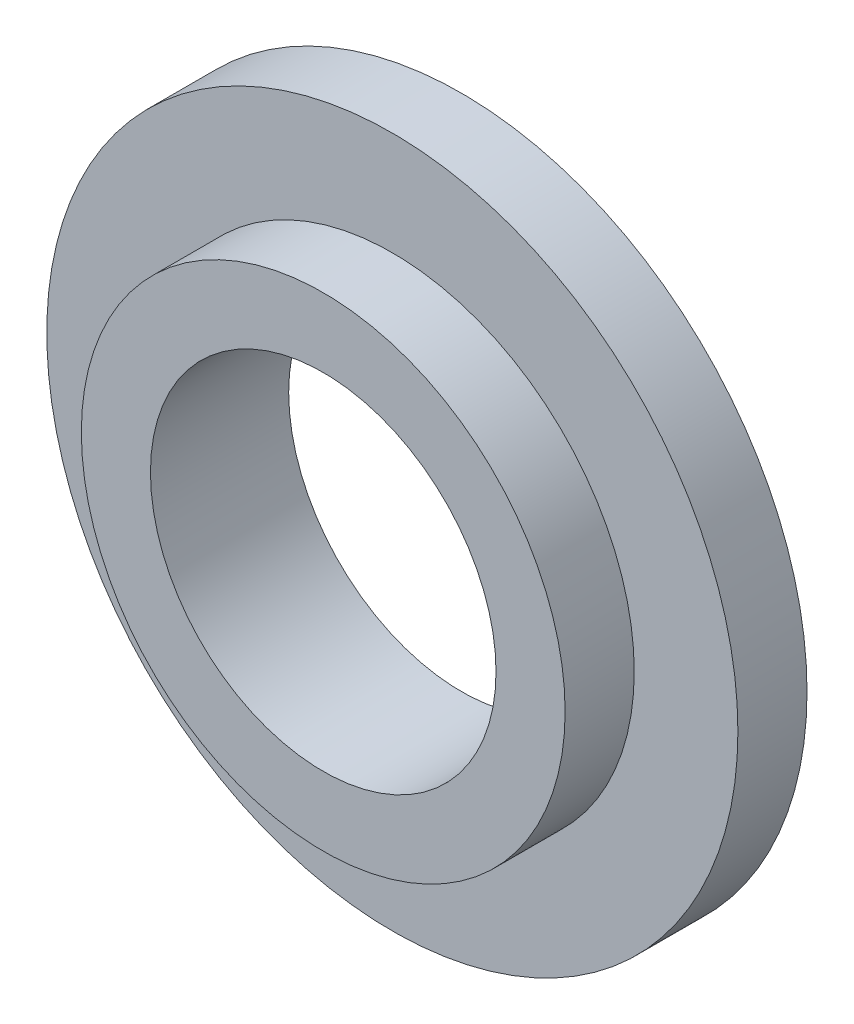
ISO-10303-21;
HEADER;
FILE_DESCRIPTION(('STEP AP214'),'2;1');
FILE_NAME('part.step','',(''),(''),'','','');
FILE_SCHEMA(('AUTOMOTIVE_DESIGN { 1 0 10303 214 1 1 1 1 }'));
ENDSEC;
DATA;
#1=APPLICATION_CONTEXT('core data for automotive mechanical design processes');
#2=APPLICATION_PROTOCOL_DEFINITION('international standard','automotive_design',2000,#1);
#3=PRODUCT_CONTEXT('',#1,'mechanical');
#4=PRODUCT('Part','Part','',(#3));
#5=PRODUCT_RELATED_PRODUCT_CATEGORY('part','',(#4));
#6=PRODUCT_DEFINITION_FORMATION('','',#4);
#7=PRODUCT_DEFINITION_CONTEXT('part definition',#1,'design');
#8=PRODUCT_DEFINITION('design','',#6,#7);
#9=PRODUCT_DEFINITION_SHAPE('','',#8);
#10=(LENGTH_UNIT() NAMED_UNIT(*) SI_UNIT(.MILLI.,.METRE.));
#11=(NAMED_UNIT(*) PLANE_ANGLE_UNIT() SI_UNIT($,.RADIAN.));
#12=(NAMED_UNIT(*) SI_UNIT($,.STERADIAN.) SOLID_ANGLE_UNIT());
#13=UNCERTAINTY_MEASURE_WITH_UNIT(LENGTH_MEASURE(1.E-05),#10,'distance_accuracy_value','');
#14=(GEOMETRIC_REPRESENTATION_CONTEXT(3) GLOBAL_UNCERTAINTY_ASSIGNED_CONTEXT((#13)) GLOBAL_UNIT_ASSIGNED_CONTEXT((#10,
#11,#12)) REPRESENTATION_CONTEXT('',''));
#15=CARTESIAN_POINT('',(0.,0.,0.));
#16=DIRECTION('',(0.,0.,1.));
#17=DIRECTION('',(1.,0.,0.));
#18=AXIS2_PLACEMENT_3D('',#15,#16,#17);
#19=CARTESIAN_POINT('',(0.,0.,1.));
#20=DIRECTION('',(0.,0.,-1.));
#21=DIRECTION('',(-1.,0.,0.));
#22=AXIS2_PLACEMENT_3D('',#19,#20,#21);
#23=CYLINDRICAL_SURFACE('',#22,5.);
#24=CARTESIAN_POINT('',(0.,0.,1.));
#25=DIRECTION('',(0.,0.,1.));
#26=DIRECTION('',(1.,0.,0.));
#27=AXIS2_PLACEMENT_3D('',#24,#25,#26);
#28=CIRCLE('',#27,5.);
#29=CARTESIAN_POINT('',(5.,0.,1.));
#30=VERTEX_POINT('',#29);
#31=EDGE_CURVE('E10',#30,#30,#28,.T.);
#32=ORIENTED_EDGE('',*,*,#31,.F.);
#33=EDGE_LOOP('',(#32));
#34=FACE_BOUND('',#33,.T.);
#35=CARTESIAN_POINT('',(0.,0.,0.));
#36=DIRECTION('',(0.,0.,1.));
#37=DIRECTION('',(1.,0.,0.));
#38=AXIS2_PLACEMENT_3D('',#35,#36,#37);
#39=CIRCLE('',#38,5.);
#40=CARTESIAN_POINT('',(5.,0.,0.));
#41=VERTEX_POINT('',#40);
#42=EDGE_CURVE('E45',#41,#41,#39,.T.);
#43=ORIENTED_EDGE('',*,*,#42,.T.);
#44=EDGE_LOOP('',(#43));
#45=FACE_BOUND('',#44,.T.);
#46=ADVANCED_FACE('F37',(#34,#45),#23,.T.);
#47=CARTESIAN_POINT('',(0.,0.,1.));
#48=DIRECTION('',(0.,0.,1.));
#49=DIRECTION('',(1.,0.,0.));
#50=AXIS2_PLACEMENT_3D('',#47,#48,#49);
#51=PLANE('',#50);
#52=CARTESIAN_POINT('',(0.,0.,1.));
#53=DIRECTION('',(0.,0.,1.));
#54=DIRECTION('',(1.,0.,0.));
#55=AXIS2_PLACEMENT_3D('',#52,#53,#54);
#56=CIRCLE('',#55,3.5);
#57=CARTESIAN_POINT('',(3.5,0.,1.));
#58=VERTEX_POINT('',#57);
#59=EDGE_CURVE('E53',#58,#58,#56,.T.);
#60=ORIENTED_EDGE('',*,*,#59,.F.);
#61=EDGE_LOOP('',(#60));
#62=FACE_BOUND('',#61,.T.);
#63=ORIENTED_EDGE('',*,*,#31,.T.);
#64=EDGE_LOOP('',(#63));
#65=FACE_BOUND('',#64,.T.);
#66=ADVANCED_FACE('F84',(#62,#65),#51,.T.);
#67=CARTESIAN_POINT('',(0.,0.,0.));
#68=DIRECTION('',(0.,0.,1.));
#69=DIRECTION('',(1.,0.,0.));
#70=AXIS2_PLACEMENT_3D('',#67,#68,#69);
#71=PLANE('',#70);
#72=CARTESIAN_POINT('',(0.,0.,0.));
#73=DIRECTION('',(0.,0.,1.));
#74=DIRECTION('',(1.,0.,0.));
#75=AXIS2_PLACEMENT_3D('',#72,#73,#74);
#76=CIRCLE('',#75,2.5);
#77=CARTESIAN_POINT('',(2.5,0.,0.));
#78=VERTEX_POINT('',#77);
#79=EDGE_CURVE('E40',#78,#78,#76,.T.);
#80=ORIENTED_EDGE('',*,*,#79,.T.);
#81=EDGE_LOOP('',(#80));
#82=FACE_BOUND('',#81,.T.);
#83=ORIENTED_EDGE('',*,*,#42,.F.);
#84=EDGE_LOOP('',(#83));
#85=FACE_BOUND('',#84,.T.);
#86=ADVANCED_FACE('F69',(#82,#85),#71,.F.);
#87=CARTESIAN_POINT('',(0.,0.,2.));
#88=DIRECTION('',(0.,0.,1.));
#89=DIRECTION('',(1.,0.,0.));
#90=AXIS2_PLACEMENT_3D('',#87,#88,#89);
#91=PLANE('',#90);
#92=CARTESIAN_POINT('',(0.,0.,2.));
#93=DIRECTION('',(0.,0.,1.));
#94=DIRECTION('',(1.,0.,0.));
#95=AXIS2_PLACEMENT_3D('',#92,#93,#94);
#96=CIRCLE('',#95,3.5);
#97=CARTESIAN_POINT('',(3.5,0.,2.));
#98=VERTEX_POINT('',#97);
#99=EDGE_CURVE('E51',#98,#98,#96,.T.);
#100=ORIENTED_EDGE('',*,*,#99,.T.);
#101=EDGE_LOOP('',(#100));
#102=FACE_BOUND('',#101,.T.);
#103=CARTESIAN_POINT('',(0.,0.,2.));
#104=DIRECTION('',(0.,0.,1.));
#105=DIRECTION('',(1.,0.,0.));
#106=AXIS2_PLACEMENT_3D('',#103,#104,#105);
#107=CIRCLE('',#106,2.5);
#108=CARTESIAN_POINT('',(2.5,0.,2.));
#109=VERTEX_POINT('',#108);
#110=EDGE_CURVE('E57',#109,#109,#107,.T.);
#111=ORIENTED_EDGE('',*,*,#110,.F.);
#112=EDGE_LOOP('',(#111));
#113=FACE_BOUND('',#112,.T.);
#114=ADVANCED_FACE('F79',(#102,#113),#91,.T.);
#115=CARTESIAN_POINT('',(0.,0.,2.));
#116=DIRECTION('',(0.,0.,-1.));
#117=DIRECTION('',(-1.,0.,0.));
#118=AXIS2_PLACEMENT_3D('',#115,#116,#117);
#119=CYLINDRICAL_SURFACE('',#118,3.5);
#120=ORIENTED_EDGE('',*,*,#99,.F.);
#121=EDGE_LOOP('',(#120));
#122=FACE_BOUND('',#121,.T.);
#123=ORIENTED_EDGE('',*,*,#59,.T.);
#124=EDGE_LOOP('',(#123));
#125=FACE_BOUND('',#124,.T.);
#126=ADVANCED_FACE('F74',(#122,#125),#119,.T.);
#127=CARTESIAN_POINT('',(0.,0.,2.));
#128=DIRECTION('',(0.,0.,-1.));
#129=DIRECTION('',(-1.,0.,0.));
#130=AXIS2_PLACEMENT_3D('',#127,#128,#129);
#131=CYLINDRICAL_SURFACE('',#130,2.5);
#132=ORIENTED_EDGE('',*,*,#110,.T.);
#133=EDGE_LOOP('',(#132));
#134=FACE_BOUND('',#133,.T.);
#135=ORIENTED_EDGE('',*,*,#79,.F.);
#136=EDGE_LOOP('',(#135));
#137=FACE_BOUND('',#136,.T.);
#138=ADVANCED_FACE('F72',(#134,#137),#131,.F.);
#139=CLOSED_SHELL('',(#46,#66,#86,#114,#126,#138));
#140=MANIFOLD_SOLID_BREP('B2',#139);
#141=ADVANCED_BREP_SHAPE_REPRESENTATION('',(#18,#140),#14);
#142=SHAPE_DEFINITION_REPRESENTATION(#9,#141);
ENDSEC;
END-ISO-10303-21;
